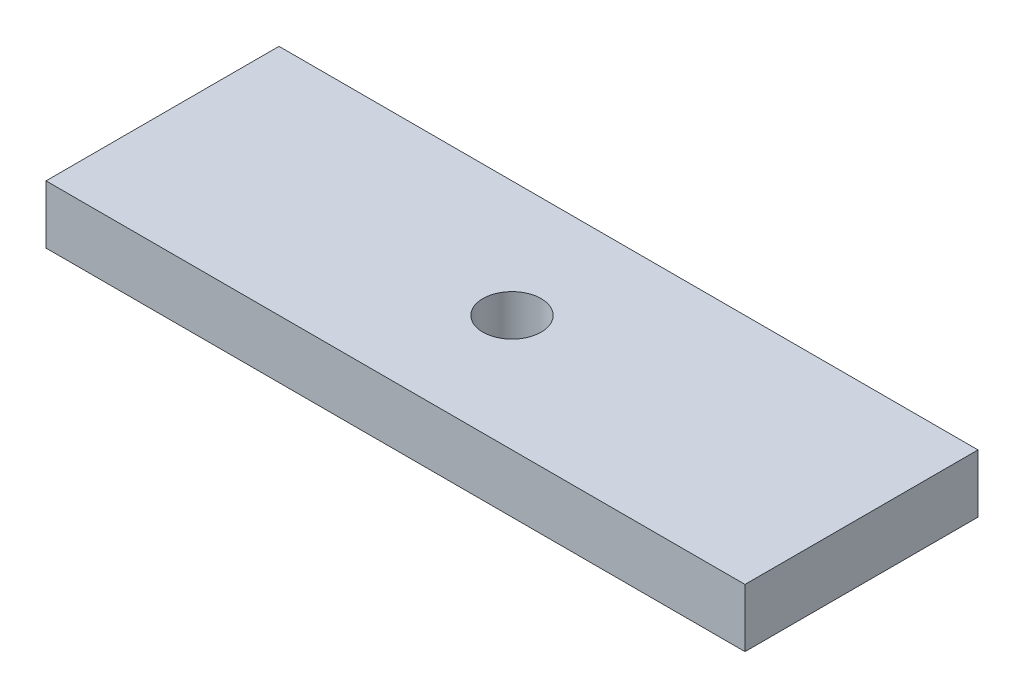
ISO-10303-21;
HEADER;
FILE_DESCRIPTION(('STEP AP214'),'2;1');
FILE_NAME('part.step','',(''),(''),'','','');
FILE_SCHEMA(('AUTOMOTIVE_DESIGN { 1 0 10303 214 1 1 1 1 }'));
ENDSEC;
DATA;
#1=APPLICATION_CONTEXT('core data for automotive mechanical design processes');
#2=APPLICATION_PROTOCOL_DEFINITION('international standard','automotive_design',2000,#1);
#3=PRODUCT_CONTEXT('',#1,'mechanical');
#4=PRODUCT('Part','Part','',(#3));
#5=PRODUCT_RELATED_PRODUCT_CATEGORY('part','',(#4));
#6=PRODUCT_DEFINITION_FORMATION('','',#4);
#7=PRODUCT_DEFINITION_CONTEXT('part definition',#1,'design');
#8=PRODUCT_DEFINITION('design','',#6,#7);
#9=PRODUCT_DEFINITION_SHAPE('','',#8);
#10=(LENGTH_UNIT() NAMED_UNIT(*) SI_UNIT(.MILLI.,.METRE.));
#11=(NAMED_UNIT(*) PLANE_ANGLE_UNIT() SI_UNIT($,.RADIAN.));
#12=(NAMED_UNIT(*) SI_UNIT($,.STERADIAN.) SOLID_ANGLE_UNIT());
#13=UNCERTAINTY_MEASURE_WITH_UNIT(LENGTH_MEASURE(1.E-05),#10,'distance_accuracy_value','');
#14=(GEOMETRIC_REPRESENTATION_CONTEXT(3) GLOBAL_UNCERTAINTY_ASSIGNED_CONTEXT((#13)) GLOBAL_UNIT_ASSIGNED_CONTEXT((#10,
#11,#12)) REPRESENTATION_CONTEXT('',''));
#15=CARTESIAN_POINT('',(0.,0.,0.));
#16=DIRECTION('',(0.,0.,1.));
#17=DIRECTION('',(1.,0.,0.));
#18=AXIS2_PLACEMENT_3D('',#15,#16,#17);
#19=CARTESIAN_POINT('',(30.,5.,-10.));
#20=DIRECTION('',(-1.,0.,0.));
#21=DIRECTION('',(0.,0.,1.));
#22=AXIS2_PLACEMENT_3D('',#19,#20,#21);
#23=PLANE('',#22);
#24=DIRECTION('',(0.,0.,-1.));
#25=VECTOR('',#24,1.);
#26=CARTESIAN_POINT('',(30.,0.,-10.));
#27=LINE('',#26,#25);
#28=CARTESIAN_POINT('',(30.,0.,9.99999999999999));
#29=VERTEX_POINT('',#28);
#30=CARTESIAN_POINT('',(30.,0.,-10.));
#31=VERTEX_POINT('',#30);
#32=EDGE_CURVE('E112',#29,#31,#27,.T.);
#33=ORIENTED_EDGE('',*,*,#32,.T.);
#34=DIRECTION('',(0.,-1.,0.));
#35=VECTOR('',#34,1.);
#36=CARTESIAN_POINT('',(30.,5.,-10.));
#37=LINE('',#36,#35);
#38=CARTESIAN_POINT('',(30.,5.,-10.));
#39=VERTEX_POINT('',#38);
#40=EDGE_CURVE('E11',#39,#31,#37,.T.);
#41=ORIENTED_EDGE('',*,*,#40,.F.);
#42=DIRECTION('',(0.,0.,-1.));
#43=VECTOR('',#42,1.);
#44=CARTESIAN_POINT('',(30.,5.,-10.));
#45=LINE('',#44,#43);
#46=CARTESIAN_POINT('',(30.,5.,9.99999999999999));
#47=VERTEX_POINT('',#46);
#48=EDGE_CURVE('E96',#47,#39,#45,.T.);
#49=ORIENTED_EDGE('',*,*,#48,.F.);
#50=DIRECTION('',(0.,-1.,0.));
#51=VECTOR('',#50,1.);
#52=CARTESIAN_POINT('',(30.,5.,9.99999999999999));
#53=LINE('',#52,#51);
#54=EDGE_CURVE('E108',#47,#29,#53,.T.);
#55=ORIENTED_EDGE('',*,*,#54,.T.);
#56=EDGE_LOOP('',(#33,#41,#49,#55));
#57=FACE_BOUND('',#56,.T.);
#58=ADVANCED_FACE('F44',(#57),#23,.F.);
#59=CARTESIAN_POINT('',(-30.,5.,-10.));
#60=DIRECTION('',(0.,0.,1.));
#61=DIRECTION('',(1.,0.,0.));
#62=AXIS2_PLACEMENT_3D('',#59,#60,#61);
#63=PLANE('',#62);
#64=DIRECTION('',(-1.,0.,0.));
#65=VECTOR('',#64,1.);
#66=CARTESIAN_POINT('',(-30.,0.,-10.));
#67=LINE('',#66,#65);
#68=CARTESIAN_POINT('',(-30.,0.,-10.));
#69=VERTEX_POINT('',#68);
#70=EDGE_CURVE('E101',#31,#69,#67,.T.);
#71=ORIENTED_EDGE('',*,*,#70,.T.);
#72=DIRECTION('',(0.,-1.,0.));
#73=VECTOR('',#72,1.);
#74=CARTESIAN_POINT('',(-30.,5.,-10.));
#75=LINE('',#74,#73);
#76=CARTESIAN_POINT('',(-30.,5.,-10.));
#77=VERTEX_POINT('',#76);
#78=EDGE_CURVE('E53',#77,#69,#75,.T.);
#79=ORIENTED_EDGE('',*,*,#78,.F.);
#80=DIRECTION('',(-1.,0.,0.));
#81=VECTOR('',#80,1.);
#82=CARTESIAN_POINT('',(-30.,5.,-10.));
#83=LINE('',#82,#81);
#84=EDGE_CURVE('E91',#39,#77,#83,.T.);
#85=ORIENTED_EDGE('',*,*,#84,.F.);
#86=ORIENTED_EDGE('',*,*,#40,.T.);
#87=EDGE_LOOP('',(#71,#79,#85,#86));
#88=FACE_BOUND('',#87,.T.);
#89=ADVANCED_FACE('F100',(#88),#63,.F.);
#90=CARTESIAN_POINT('',(-30.,5.,-10.));
#91=DIRECTION('',(1.,0.,0.));
#92=DIRECTION('',(0.,0.,-1.));
#93=AXIS2_PLACEMENT_3D('',#90,#91,#92);
#94=PLANE('',#93);
#95=DIRECTION('',(0.,0.,1.));
#96=VECTOR('',#95,1.);
#97=CARTESIAN_POINT('',(-30.,0.,-10.));
#98=LINE('',#97,#96);
#99=CARTESIAN_POINT('',(-30.,0.,9.99999999999999));
#100=VERTEX_POINT('',#99);
#101=EDGE_CURVE('E78',#69,#100,#98,.T.);
#102=ORIENTED_EDGE('',*,*,#101,.T.);
#103=DIRECTION('',(0.,-1.,0.));
#104=VECTOR('',#103,1.);
#105=CARTESIAN_POINT('',(-30.,5.,9.99999999999999));
#106=LINE('',#105,#104);
#107=CARTESIAN_POINT('',(-30.,5.,9.99999999999999));
#108=VERTEX_POINT('',#107);
#109=EDGE_CURVE('E103',#108,#100,#106,.T.);
#110=ORIENTED_EDGE('',*,*,#109,.F.);
#111=DIRECTION('',(0.,0.,1.));
#112=VECTOR('',#111,1.);
#113=CARTESIAN_POINT('',(-30.,5.,-10.));
#114=LINE('',#113,#112);
#115=EDGE_CURVE('E94',#77,#108,#114,.T.);
#116=ORIENTED_EDGE('',*,*,#115,.F.);
#117=ORIENTED_EDGE('',*,*,#78,.T.);
#118=EDGE_LOOP('',(#102,#110,#116,#117));
#119=FACE_BOUND('',#118,.T.);
#120=ADVANCED_FACE('F104',(#119),#94,.F.);
#121=CARTESIAN_POINT('',(-30.,5.,9.99999999999999));
#122=DIRECTION('',(0.,0.,-1.));
#123=DIRECTION('',(-1.,0.,0.));
#124=AXIS2_PLACEMENT_3D('',#121,#122,#123);
#125=PLANE('',#124);
#126=DIRECTION('',(1.,0.,0.));
#127=VECTOR('',#126,1.);
#128=CARTESIAN_POINT('',(-30.,0.,9.99999999999999));
#129=LINE('',#128,#127);
#130=EDGE_CURVE('E84',#100,#29,#129,.T.);
#131=ORIENTED_EDGE('',*,*,#130,.T.);
#132=ORIENTED_EDGE('',*,*,#54,.F.);
#133=DIRECTION('',(1.,0.,0.));
#134=VECTOR('',#133,1.);
#135=CARTESIAN_POINT('',(-30.,5.,9.99999999999999));
#136=LINE('',#135,#134);
#137=EDGE_CURVE('E61',#108,#47,#136,.T.);
#138=ORIENTED_EDGE('',*,*,#137,.F.);
#139=ORIENTED_EDGE('',*,*,#109,.T.);
#140=EDGE_LOOP('',(#131,#132,#138,#139));
#141=FACE_BOUND('',#140,.T.);
#142=ADVANCED_FACE('F126',(#141),#125,.F.);
#143=CARTESIAN_POINT('',(0.,5.,0.));
#144=DIRECTION('',(0.,1.,0.));
#145=DIRECTION('',(0.,0.,1.));
#146=AXIS2_PLACEMENT_3D('',#143,#144,#145);
#147=PLANE('',#146);
#148=CARTESIAN_POINT('',(0.,5.,0.));
#149=DIRECTION('',(0.,1.,0.));
#150=DIRECTION('',(0.,0.,1.));
#151=AXIS2_PLACEMENT_3D('',#148,#149,#150);
#152=CIRCLE('',#151,2.5);
#153=CARTESIAN_POINT('',(0.,5.,2.5));
#154=VERTEX_POINT('',#153);
#155=EDGE_CURVE('E133',#154,#154,#152,.T.);
#156=ORIENTED_EDGE('',*,*,#155,.F.);
#157=EDGE_LOOP('',(#156));
#158=FACE_BOUND('',#157,.T.);
#159=ORIENTED_EDGE('',*,*,#48,.T.);
#160=ORIENTED_EDGE('',*,*,#84,.T.);
#161=ORIENTED_EDGE('',*,*,#115,.T.);
#162=ORIENTED_EDGE('',*,*,#137,.T.);
#163=EDGE_LOOP('',(#159,#160,#161,#162));
#164=FACE_BOUND('',#163,.T.);
#165=ADVANCED_FACE('F92',(#158,#164),#147,.T.);
#166=CARTESIAN_POINT('',(0.,0.,0.));
#167=DIRECTION('',(0.,1.,0.));
#168=DIRECTION('',(0.,0.,1.));
#169=AXIS2_PLACEMENT_3D('',#166,#167,#168);
#170=PLANE('',#169);
#171=CARTESIAN_POINT('',(0.,0.,0.));
#172=DIRECTION('',(0.,1.,0.));
#173=DIRECTION('',(0.,0.,1.));
#174=AXIS2_PLACEMENT_3D('',#171,#172,#173);
#175=CIRCLE('',#174,2.5);
#176=CARTESIAN_POINT('',(0.,0.,2.5));
#177=VERTEX_POINT('',#176);
#178=EDGE_CURVE('E116',#177,#177,#175,.T.);
#179=ORIENTED_EDGE('',*,*,#178,.T.);
#180=EDGE_LOOP('',(#179));
#181=FACE_BOUND('',#180,.T.);
#182=ORIENTED_EDGE('',*,*,#32,.F.);
#183=ORIENTED_EDGE('',*,*,#130,.F.);
#184=ORIENTED_EDGE('',*,*,#101,.F.);
#185=ORIENTED_EDGE('',*,*,#70,.F.);
#186=EDGE_LOOP('',(#182,#183,#184,#185));
#187=FACE_BOUND('',#186,.T.);
#188=ADVANCED_FACE('F129',(#181,#187),#170,.F.);
#189=CARTESIAN_POINT('',(0.,0.,0.));
#190=DIRECTION('',(0.,1.,0.));
#191=DIRECTION('',(0.,0.,1.));
#192=AXIS2_PLACEMENT_3D('',#189,#190,#191);
#193=CYLINDRICAL_SURFACE('',#192,2.5);
#194=ORIENTED_EDGE('',*,*,#178,.F.);
#195=EDGE_LOOP('',(#194));
#196=FACE_BOUND('',#195,.T.);
#197=ORIENTED_EDGE('',*,*,#155,.T.);
#198=EDGE_LOOP('',(#197));
#199=FACE_BOUND('',#198,.T.);
#200=ADVANCED_FACE('F142',(#196,#199),#193,.F.);
#201=CLOSED_SHELL('',(#58,#89,#120,#142,#165,#188,#200));
#202=MANIFOLD_SOLID_BREP('B2',#201);
#203=ADVANCED_BREP_SHAPE_REPRESENTATION('',(#18,#202),#14);
#204=SHAPE_DEFINITION_REPRESENTATION(#9,#203);
ENDSEC;
END-ISO-10303-21;
